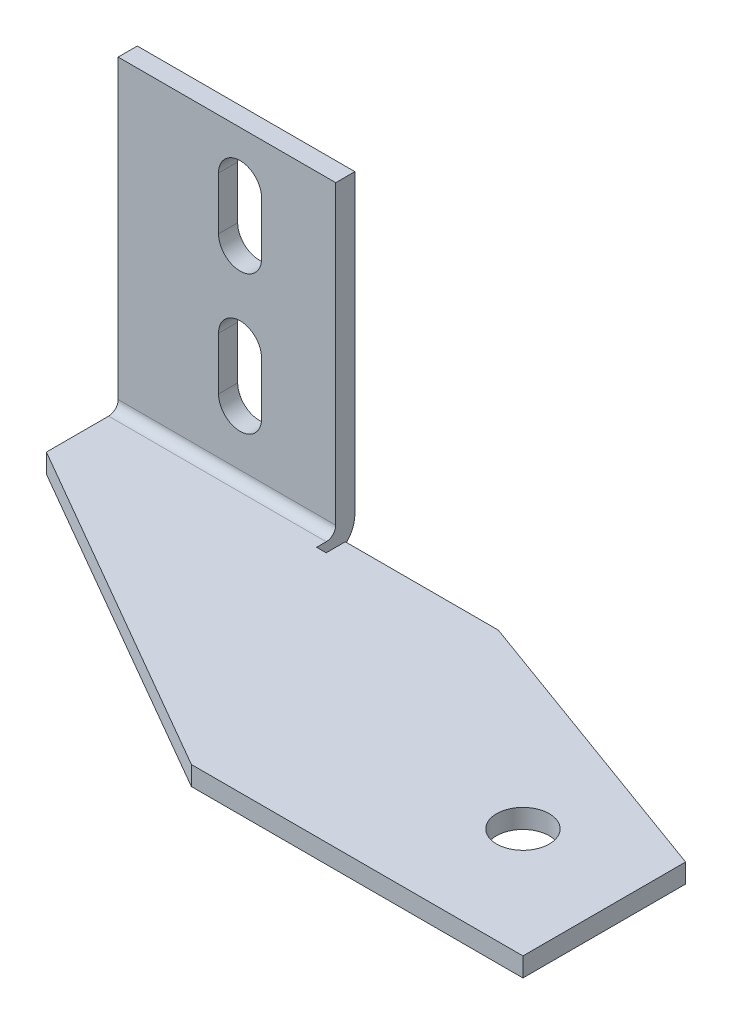
ISO-10303-21;
HEADER;
FILE_DESCRIPTION(('STEP AP214'),'2;1');
FILE_NAME('part.step','',(''),(''),'','','');
FILE_SCHEMA(('AUTOMOTIVE_DESIGN { 1 0 10303 214 1 1 1 1 }'));
ENDSEC;
DATA;
#1=APPLICATION_CONTEXT('core data for automotive mechanical design processes');
#2=APPLICATION_PROTOCOL_DEFINITION('international standard','automotive_design',2000,#1);
#3=PRODUCT_CONTEXT('',#1,'mechanical');
#4=PRODUCT('Part','Part','',(#3));
#5=PRODUCT_RELATED_PRODUCT_CATEGORY('part','',(#4));
#6=PRODUCT_DEFINITION_FORMATION('','',#4);
#7=PRODUCT_DEFINITION_CONTEXT('part definition',#1,'design');
#8=PRODUCT_DEFINITION('design','',#6,#7);
#9=PRODUCT_DEFINITION_SHAPE('','',#8);
#10=(LENGTH_UNIT() NAMED_UNIT(*) SI_UNIT(.MILLI.,.METRE.));
#11=(NAMED_UNIT(*) PLANE_ANGLE_UNIT() SI_UNIT($,.RADIAN.));
#12=(NAMED_UNIT(*) SI_UNIT($,.STERADIAN.) SOLID_ANGLE_UNIT());
#13=UNCERTAINTY_MEASURE_WITH_UNIT(LENGTH_MEASURE(1.E-05),#10,'distance_accuracy_value','');
#14=(GEOMETRIC_REPRESENTATION_CONTEXT(3) GLOBAL_UNCERTAINTY_ASSIGNED_CONTEXT((#13)) GLOBAL_UNIT_ASSIGNED_CONTEXT((#10,
#11,#12)) REPRESENTATION_CONTEXT('',''));
#15=CARTESIAN_POINT('',(0.,0.,0.));
#16=DIRECTION('',(0.,0.,1.));
#17=DIRECTION('',(1.,0.,0.));
#18=AXIS2_PLACEMENT_3D('',#15,#16,#17);
#19=CARTESIAN_POINT('',(0.,34.,0.));
#20=DIRECTION('',(0.,0.,1.));
#21=DIRECTION('',(1.,0.,0.));
#22=AXIS2_PLACEMENT_3D('',#19,#20,#21);
#23=PLANE('',#22);
#24=DIRECTION('',(0.,-1.,0.));
#25=VECTOR('',#24,1.);
#26=CARTESIAN_POINT('',(0.,34.,0.));
#27=LINE('',#26,#25);
#28=CARTESIAN_POINT('',(0.,34.,0.));
#29=VERTEX_POINT('',#28);
#30=CARTESIAN_POINT('',(0.,3.,0.));
#31=VERTEX_POINT('',#30);
#32=EDGE_CURVE('E340',#29,#31,#27,.T.);
#33=ORIENTED_EDGE('',*,*,#32,.T.);
#34=DIRECTION('',(-1.,0.,0.));
#35=VECTOR('',#34,1.);
#36=CARTESIAN_POINT('',(0.,3.,0.));
#37=LINE('',#36,#35);
#38=CARTESIAN_POINT('',(22.7379024351809,3.,0.));
#39=VERTEX_POINT('',#38);
#40=EDGE_CURVE('E64',#31,#39,#37,.F.);
#41=ORIENTED_EDGE('',*,*,#40,.T.);
#42=DIRECTION('',(0.,-1.,0.));
#43=VECTOR('',#42,1.);
#44=CARTESIAN_POINT('',(22.7379024351809,34.,0.));
#45=LINE('',#44,#43);
#46=CARTESIAN_POINT('',(22.7379024351809,34.,0.));
#47=VERTEX_POINT('',#46);
#48=EDGE_CURVE('E344',#47,#39,#45,.T.);
#49=ORIENTED_EDGE('',*,*,#48,.F.);
#50=DIRECTION('',(-1.,0.,0.));
#51=VECTOR('',#50,1.);
#52=CARTESIAN_POINT('',(0.,34.,0.));
#53=LINE('',#52,#51);
#54=EDGE_CURVE('E335',#47,#29,#53,.T.);
#55=ORIENTED_EDGE('',*,*,#54,.T.);
#56=EDGE_LOOP('',(#33,#41,#49,#55));
#57=FACE_BOUND('',#56,.T.);
#58=DIRECTION('',(0.,1.,0.));
#59=VECTOR('',#58,1.);
#60=CARTESIAN_POINT('',(10.4879024351809,14.25,0.));
#61=LINE('',#60,#59);
#62=CARTESIAN_POINT('',(10.4879024351809,8.74999999999999,0.));
#63=VERTEX_POINT('',#62);
#64=CARTESIAN_POINT('',(10.4879024351809,14.25,0.));
#65=VERTEX_POINT('',#64);
#66=EDGE_CURVE('E297',#63,#65,#61,.T.);
#67=ORIENTED_EDGE('',*,*,#66,.T.);
#68=CARTESIAN_POINT('',(12.7379024351809,14.25,0.));
#69=DIRECTION('',(0.,0.,-1.));
#70=DIRECTION('',(1.,0.,0.));
#71=AXIS2_PLACEMENT_3D('',#68,#69,#70);
#72=CIRCLE('',#71,2.25);
#73=CARTESIAN_POINT('',(14.9879024351809,14.25,0.));
#74=VERTEX_POINT('',#73);
#75=EDGE_CURVE('E260',#65,#74,#72,.T.);
#76=ORIENTED_EDGE('',*,*,#75,.T.);
#77=DIRECTION('',(0.,-1.,0.));
#78=VECTOR('',#77,1.);
#79=CARTESIAN_POINT('',(14.9879024351809,14.25,0.));
#80=LINE('',#79,#78);
#81=CARTESIAN_POINT('',(14.9879024351809,8.74999999999999,0.));
#82=VERTEX_POINT('',#81);
#83=EDGE_CURVE('E306',#74,#82,#80,.T.);
#84=ORIENTED_EDGE('',*,*,#83,.T.);
#85=CARTESIAN_POINT('',(12.7379024351809,8.74999999999999,0.));
#86=DIRECTION('',(0.,0.,-1.));
#87=DIRECTION('',(1.,0.,0.));
#88=AXIS2_PLACEMENT_3D('',#85,#86,#87);
#89=CIRCLE('',#88,2.25);
#90=EDGE_CURVE('E301',#82,#63,#89,.T.);
#91=ORIENTED_EDGE('',*,*,#90,.T.);
#92=EDGE_LOOP('',(#67,#76,#84,#91));
#93=FACE_BOUND('',#92,.T.);
#94=DIRECTION('',(0.,1.,0.));
#95=VECTOR('',#94,1.);
#96=CARTESIAN_POINT('',(10.4879024351809,28.75,0.));
#97=LINE('',#96,#95);
#98=CARTESIAN_POINT('',(10.4879024351809,23.25,0.));
#99=VERTEX_POINT('',#98);
#100=CARTESIAN_POINT('',(10.4879024351809,28.75,0.));
#101=VERTEX_POINT('',#100);
#102=EDGE_CURVE('E244',#99,#101,#97,.T.);
#103=ORIENTED_EDGE('',*,*,#102,.T.);
#104=CARTESIAN_POINT('',(12.7379024351809,28.75,0.));
#105=DIRECTION('',(0.,0.,-1.));
#106=DIRECTION('',(1.,0.,0.));
#107=AXIS2_PLACEMENT_3D('',#104,#105,#106);
#108=CIRCLE('',#107,2.25);
#109=CARTESIAN_POINT('',(14.9879024351809,28.75,0.));
#110=VERTEX_POINT('',#109);
#111=EDGE_CURVE('E255',#101,#110,#108,.T.);
#112=ORIENTED_EDGE('',*,*,#111,.T.);
#113=DIRECTION('',(0.,-1.,0.));
#114=VECTOR('',#113,1.);
#115=CARTESIAN_POINT('',(14.9879024351809,28.75,0.));
#116=LINE('',#115,#114);
#117=CARTESIAN_POINT('',(14.9879024351809,23.25,0.));
#118=VERTEX_POINT('',#117);
#119=EDGE_CURVE('E259',#110,#118,#116,.T.);
#120=ORIENTED_EDGE('',*,*,#119,.T.);
#121=CARTESIAN_POINT('',(12.7379024351809,23.25,0.));
#122=DIRECTION('',(0.,0.,-1.));
#123=DIRECTION('',(1.,0.,0.));
#124=AXIS2_PLACEMENT_3D('',#121,#122,#123);
#125=CIRCLE('',#124,2.25);
#126=EDGE_CURVE('E264',#118,#99,#125,.T.);
#127=ORIENTED_EDGE('',*,*,#126,.T.);
#128=EDGE_LOOP('',(#103,#112,#120,#127));
#129=FACE_BOUND('',#128,.T.);
#130=ADVANCED_FACE('F42',(#57,#93,#129),#23,.T.);
#131=CARTESIAN_POINT('',(22.7379024351809,34.,-2.));
#132=DIRECTION('',(0.,0.,-1.));
#133=DIRECTION('',(-1.,0.,0.));
#134=AXIS2_PLACEMENT_3D('',#131,#132,#133);
#135=PLANE('',#134);
#136=DIRECTION('',(0.,-1.,0.));
#137=VECTOR('',#136,1.);
#138=CARTESIAN_POINT('',(22.7379024351809,34.,-2.));
#139=LINE('',#138,#137);
#140=CARTESIAN_POINT('',(22.7379024351809,34.,-2.));
#141=VERTEX_POINT('',#140);
#142=CARTESIAN_POINT('',(22.7379024351809,3.,-2.));
#143=VERTEX_POINT('',#142);
#144=EDGE_CURVE('E347',#141,#143,#139,.T.);
#145=ORIENTED_EDGE('',*,*,#144,.T.);
#146=DIRECTION('',(1.,0.,0.));
#147=VECTOR('',#146,1.);
#148=CARTESIAN_POINT('',(22.7379024351809,3.,-2.));
#149=LINE('',#148,#147);
#150=CARTESIAN_POINT('',(0.,3.,-2.));
#151=VERTEX_POINT('',#150);
#152=EDGE_CURVE('E424',#143,#151,#149,.F.);
#153=ORIENTED_EDGE('',*,*,#152,.T.);
#154=DIRECTION('',(0.,-1.,0.));
#155=VECTOR('',#154,1.);
#156=CARTESIAN_POINT('',(0.,34.,-2.));
#157=LINE('',#156,#155);
#158=CARTESIAN_POINT('',(0.,34.,-2.));
#159=VERTEX_POINT('',#158);
#160=EDGE_CURVE('E338',#159,#151,#157,.T.);
#161=ORIENTED_EDGE('',*,*,#160,.F.);
#162=DIRECTION('',(1.,0.,0.));
#163=VECTOR('',#162,1.);
#164=CARTESIAN_POINT('',(22.7379024351809,34.,-2.));
#165=LINE('',#164,#163);
#166=EDGE_CURVE('E327',#159,#141,#165,.T.);
#167=ORIENTED_EDGE('',*,*,#166,.T.);
#168=EDGE_LOOP('',(#145,#153,#161,#167));
#169=FACE_BOUND('',#168,.T.);
#170=DIRECTION('',(0.,-1.,0.));
#171=VECTOR('',#170,1.);
#172=CARTESIAN_POINT('',(14.9879024351809,14.25,-2.));
#173=LINE('',#172,#171);
#174=CARTESIAN_POINT('',(14.9879024351809,14.25,-2.));
#175=VERTEX_POINT('',#174);
#176=CARTESIAN_POINT('',(14.9879024351809,8.74999999999999,-2.));
#177=VERTEX_POINT('',#176);
#178=EDGE_CURVE('E319',#175,#177,#173,.T.);
#179=ORIENTED_EDGE('',*,*,#178,.F.);
#180=CARTESIAN_POINT('',(12.7379024351809,14.25,-2.));
#181=DIRECTION('',(0.,0.,-1.));
#182=DIRECTION('',(1.,0.,0.));
#183=AXIS2_PLACEMENT_3D('',#180,#181,#182);
#184=CIRCLE('',#183,2.25);
#185=CARTESIAN_POINT('',(10.4879024351809,14.25,-2.));
#186=VERTEX_POINT('',#185);
#187=EDGE_CURVE('E302',#186,#175,#184,.T.);
#188=ORIENTED_EDGE('',*,*,#187,.F.);
#189=DIRECTION('',(0.,1.,0.));
#190=VECTOR('',#189,1.);
#191=CARTESIAN_POINT('',(10.4879024351809,14.25,-2.));
#192=LINE('',#191,#190);
#193=CARTESIAN_POINT('',(10.4879024351809,8.74999999999999,-2.));
#194=VERTEX_POINT('',#193);
#195=EDGE_CURVE('E296',#194,#186,#192,.T.);
#196=ORIENTED_EDGE('',*,*,#195,.F.);
#197=CARTESIAN_POINT('',(12.7379024351809,8.74999999999999,-2.));
#198=DIRECTION('',(0.,0.,-1.));
#199=DIRECTION('',(1.,0.,0.));
#200=AXIS2_PLACEMENT_3D('',#197,#198,#199);
#201=CIRCLE('',#200,2.25);
#202=EDGE_CURVE('E315',#177,#194,#201,.T.);
#203=ORIENTED_EDGE('',*,*,#202,.F.);
#204=EDGE_LOOP('',(#179,#188,#196,#203));
#205=FACE_BOUND('',#204,.T.);
#206=DIRECTION('',(0.,-1.,0.));
#207=VECTOR('',#206,1.);
#208=CARTESIAN_POINT('',(14.9879024351809,28.75,-2.));
#209=LINE('',#208,#207);
#210=CARTESIAN_POINT('',(14.9879024351809,28.75,-2.));
#211=VERTEX_POINT('',#210);
#212=CARTESIAN_POINT('',(14.9879024351809,23.25,-2.));
#213=VERTEX_POINT('',#212);
#214=EDGE_CURVE('E243',#211,#213,#209,.T.);
#215=ORIENTED_EDGE('',*,*,#214,.F.);
#216=CARTESIAN_POINT('',(12.7379024351809,28.75,-2.));
#217=DIRECTION('',(0.,0.,-1.));
#218=DIRECTION('',(1.,0.,0.));
#219=AXIS2_PLACEMENT_3D('',#216,#217,#218);
#220=CIRCLE('',#219,2.25);
#221=CARTESIAN_POINT('',(10.4879024351809,28.75,-2.));
#222=VERTEX_POINT('',#221);
#223=EDGE_CURVE('E240',#222,#211,#220,.T.);
#224=ORIENTED_EDGE('',*,*,#223,.F.);
#225=DIRECTION('',(0.,1.,0.));
#226=VECTOR('',#225,1.);
#227=CARTESIAN_POINT('',(10.4879024351809,28.75,-2.));
#228=LINE('',#227,#226);
#229=CARTESIAN_POINT('',(10.4879024351809,23.25,-2.));
#230=VERTEX_POINT('',#229);
#231=EDGE_CURVE('E251',#230,#222,#228,.T.);
#232=ORIENTED_EDGE('',*,*,#231,.F.);
#233=CARTESIAN_POINT('',(12.7379024351809,23.25,-2.));
#234=DIRECTION('',(0.,0.,-1.));
#235=DIRECTION('',(1.,0.,0.));
#236=AXIS2_PLACEMENT_3D('',#233,#234,#235);
#237=CIRCLE('',#236,2.25);
#238=EDGE_CURVE('E247',#213,#230,#237,.T.);
#239=ORIENTED_EDGE('',*,*,#238,.F.);
#240=EDGE_LOOP('',(#215,#224,#232,#239));
#241=FACE_BOUND('',#240,.T.);
#242=ADVANCED_FACE('F476',(#169,#205,#241),#135,.T.);
#243=CARTESIAN_POINT('',(0.,2.,0.));
#244=DIRECTION('',(0.,0.,1.));
#245=DIRECTION('',(1.,0.,0.));
#246=AXIS2_PLACEMENT_3D('',#243,#244,#245);
#247=PLANE('',#246);
#248=DIRECTION('',(-1.,0.,0.));
#249=VECTOR('',#248,1.);
#250=CARTESIAN_POINT('',(0.,0.,0.));
#251=LINE('',#250,#249);
#252=CARTESIAN_POINT('',(39.7282529021083,0.,0.));
#253=VERTEX_POINT('',#252);
#254=CARTESIAN_POINT('',(23.7379024351809,0.,0.));
#255=VERTEX_POINT('',#254);
#256=EDGE_CURVE('E366',#253,#255,#251,.T.);
#257=ORIENTED_EDGE('',*,*,#256,.T.);
#258=DIRECTION('',(0.,1.,0.));
#259=VECTOR('',#258,1.);
#260=CARTESIAN_POINT('',(23.7379024351809,0.,0.));
#261=LINE('',#260,#259);
#262=CARTESIAN_POINT('',(23.7379024351809,2.,0.));
#263=VERTEX_POINT('',#262);
#264=EDGE_CURVE('E233',#255,#263,#261,.T.);
#265=ORIENTED_EDGE('',*,*,#264,.T.);
#266=DIRECTION('',(-1.,0.,0.));
#267=VECTOR('',#266,1.);
#268=CARTESIAN_POINT('',(0.,2.,0.));
#269=LINE('',#268,#267);
#270=CARTESIAN_POINT('',(39.7282529021083,2.,0.));
#271=VERTEX_POINT('',#270);
#272=EDGE_CURVE('E378',#271,#263,#269,.T.);
#273=ORIENTED_EDGE('',*,*,#272,.F.);
#274=DIRECTION('',(0.,-1.,0.));
#275=VECTOR('',#274,1.);
#276=CARTESIAN_POINT('',(39.7282529021083,2.,0.));
#277=LINE('',#276,#275);
#278=EDGE_CURVE('E382',#271,#253,#277,.T.);
#279=ORIENTED_EDGE('',*,*,#278,.T.);
#280=EDGE_LOOP('',(#257,#265,#273,#279));
#281=FACE_BOUND('',#280,.T.);
#282=ADVANCED_FACE('F466',(#281),#247,.F.);
#283=CARTESIAN_POINT('',(0.,2.,7.5));
#284=DIRECTION('',(1.,0.,0.));
#285=DIRECTION('',(0.,0.,-1.));
#286=AXIS2_PLACEMENT_3D('',#283,#284,#285);
#287=PLANE('',#286);
#288=ORIENTED_EDGE('',*,*,#160,.T.);
#289=CARTESIAN_POINT('',(0.,3.,0.999999999999997));
#290=DIRECTION('',(1.,0.,0.));
#291=DIRECTION('',(0.,0.,-1.));
#292=AXIS2_PLACEMENT_3D('',#289,#290,#291);
#293=CIRCLE('',#292,3.);
#294=CARTESIAN_POINT('',(0.,0.,0.999999999999998));
#295=VERTEX_POINT('',#294);
#296=EDGE_CURVE('E427',#151,#295,#293,.F.);
#297=ORIENTED_EDGE('',*,*,#296,.T.);
#298=DIRECTION('',(0.,0.,1.));
#299=VECTOR('',#298,1.);
#300=CARTESIAN_POINT('',(0.,0.,7.5));
#301=LINE('',#300,#299);
#302=CARTESIAN_POINT('',(0.,0.,7.5));
#303=VERTEX_POINT('',#302);
#304=EDGE_CURVE('E358',#295,#303,#301,.T.);
#305=ORIENTED_EDGE('',*,*,#304,.T.);
#306=DIRECTION('',(0.,-1.,0.));
#307=VECTOR('',#306,1.);
#308=CARTESIAN_POINT('',(0.,2.,7.5));
#309=LINE('',#308,#307);
#310=CARTESIAN_POINT('',(0.,2.,7.5));
#311=VERTEX_POINT('',#310);
#312=EDGE_CURVE('E415',#311,#303,#309,.T.);
#313=ORIENTED_EDGE('',*,*,#312,.F.);
#314=DIRECTION('',(0.,0.,1.));
#315=VECTOR('',#314,1.);
#316=CARTESIAN_POINT('',(0.,2.,7.5));
#317=LINE('',#316,#315);
#318=CARTESIAN_POINT('',(0.,2.,1.));
#319=VERTEX_POINT('',#318);
#320=EDGE_CURVE('E362',#319,#311,#317,.T.);
#321=ORIENTED_EDGE('',*,*,#320,.F.);
#322=CARTESIAN_POINT('',(0.,3.,1.));
#323=DIRECTION('',(1.,0.,0.));
#324=DIRECTION('',(0.,0.,-1.));
#325=AXIS2_PLACEMENT_3D('',#322,#323,#324);
#326=CIRCLE('',#325,1.);
#327=EDGE_CURVE('E51',#319,#31,#326,.T.);
#328=ORIENTED_EDGE('',*,*,#327,.T.);
#329=ORIENTED_EDGE('',*,*,#32,.F.);
#330=DIRECTION('',(0.,0.,-1.));
#331=VECTOR('',#330,1.);
#332=CARTESIAN_POINT('',(0.,34.,-2.));
#333=LINE('',#332,#331);
#334=EDGE_CURVE('E203',#29,#159,#333,.T.);
#335=ORIENTED_EDGE('',*,*,#334,.T.);
#336=EDGE_LOOP('',(#288,#297,#305,#313,#321,#328,#329,#335));
#337=FACE_BOUND('',#336,.T.);
#338=ADVANCED_FACE('F443',(#337),#287,.F.);
#339=CARTESIAN_POINT('',(35.853451716676,2.,28.2));
#340=DIRECTION('',(0.499999999999998,0.,-0.86602540378444));
#341=DIRECTION('',(-0.86602540378444,0.,-0.499999999999998));
#342=AXIS2_PLACEMENT_3D('',#339,#340,#341);
#343=PLANE('',#342);
#344=DIRECTION('',(0.86602540378444,0.,0.499999999999998));
#345=VECTOR('',#344,1.);
#346=CARTESIAN_POINT('',(35.853451716676,0.,28.2));
#347=LINE('',#346,#345);
#348=CARTESIAN_POINT('',(35.853451716676,0.,28.2));
#349=VERTEX_POINT('',#348);
#350=EDGE_CURVE('E385',#303,#349,#347,.T.);
#351=ORIENTED_EDGE('',*,*,#350,.T.);
#352=DIRECTION('',(0.,-1.,0.));
#353=VECTOR('',#352,1.);
#354=CARTESIAN_POINT('',(35.853451716676,2.,28.2));
#355=LINE('',#354,#353);
#356=CARTESIAN_POINT('',(35.853451716676,2.,28.2));
#357=VERTEX_POINT('',#356);
#358=EDGE_CURVE('E411',#357,#349,#355,.T.);
#359=ORIENTED_EDGE('',*,*,#358,.F.);
#360=DIRECTION('',(0.86602540378444,0.,0.499999999999998));
#361=VECTOR('',#360,1.);
#362=CARTESIAN_POINT('',(35.853451716676,2.,28.2));
#363=LINE('',#362,#361);
#364=EDGE_CURVE('E365',#311,#357,#363,.T.);
#365=ORIENTED_EDGE('',*,*,#364,.F.);
#366=ORIENTED_EDGE('',*,*,#312,.T.);
#367=EDGE_LOOP('',(#351,#359,#365,#366));
#368=FACE_BOUND('',#367,.T.);
#369=ADVANCED_FACE('F446',(#368),#343,.F.);
#370=CARTESIAN_POINT('',(70.5,2.,28.2));
#371=DIRECTION('',(0.,0.,-1.));
#372=DIRECTION('',(-1.,0.,0.));
#373=AXIS2_PLACEMENT_3D('',#370,#371,#372);
#374=PLANE('',#373);
#375=DIRECTION('',(1.,0.,0.));
#376=VECTOR('',#375,1.);
#377=CARTESIAN_POINT('',(70.5,0.,28.2));
#378=LINE('',#377,#376);
#379=CARTESIAN_POINT('',(70.5,0.,28.2));
#380=VERTEX_POINT('',#379);
#381=EDGE_CURVE('E388',#349,#380,#378,.T.);
#382=ORIENTED_EDGE('',*,*,#381,.T.);
#383=DIRECTION('',(0.,-1.,0.));
#384=VECTOR('',#383,1.);
#385=CARTESIAN_POINT('',(70.5,2.,28.2));
#386=LINE('',#385,#384);
#387=CARTESIAN_POINT('',(70.5,2.,28.2));
#388=VERTEX_POINT('',#387);
#389=EDGE_CURVE('E407',#388,#380,#386,.T.);
#390=ORIENTED_EDGE('',*,*,#389,.F.);
#391=DIRECTION('',(1.,0.,0.));
#392=VECTOR('',#391,1.);
#393=CARTESIAN_POINT('',(70.5,2.,28.2));
#394=LINE('',#393,#392);
#395=EDGE_CURVE('E369',#357,#388,#394,.T.);
#396=ORIENTED_EDGE('',*,*,#395,.F.);
#397=ORIENTED_EDGE('',*,*,#358,.T.);
#398=EDGE_LOOP('',(#382,#390,#396,#397));
#399=FACE_BOUND('',#398,.T.);
#400=ADVANCED_FACE('F453',(#399),#374,.F.);
#401=CARTESIAN_POINT('',(70.5,2.,11.2));
#402=DIRECTION('',(-1.,0.,0.));
#403=DIRECTION('',(0.,0.,1.));
#404=AXIS2_PLACEMENT_3D('',#401,#402,#403);
#405=PLANE('',#404);
#406=DIRECTION('',(0.,0.,-1.));
#407=VECTOR('',#406,1.);
#408=CARTESIAN_POINT('',(70.5,0.,11.2));
#409=LINE('',#408,#407);
#410=CARTESIAN_POINT('',(70.5,0.,11.2));
#411=VERTEX_POINT('',#410);
#412=EDGE_CURVE('E391',#380,#411,#409,.T.);
#413=ORIENTED_EDGE('',*,*,#412,.T.);
#414=DIRECTION('',(0.,-1.,0.));
#415=VECTOR('',#414,1.);
#416=CARTESIAN_POINT('',(70.5,2.,11.2));
#417=LINE('',#416,#415);
#418=CARTESIAN_POINT('',(70.5,2.,11.2));
#419=VERTEX_POINT('',#418);
#420=EDGE_CURVE('E403',#419,#411,#417,.T.);
#421=ORIENTED_EDGE('',*,*,#420,.F.);
#422=DIRECTION('',(0.,0.,-1.));
#423=VECTOR('',#422,1.);
#424=CARTESIAN_POINT('',(70.5,2.,11.2));
#425=LINE('',#424,#423);
#426=EDGE_CURVE('E372',#388,#419,#425,.T.);
#427=ORIENTED_EDGE('',*,*,#426,.F.);
#428=ORIENTED_EDGE('',*,*,#389,.T.);
#429=EDGE_LOOP('',(#413,#421,#427,#428));
#430=FACE_BOUND('',#429,.T.);
#431=ADVANCED_FACE('F457',(#430),#405,.F.);
#432=CARTESIAN_POINT('',(39.7282529021083,2.,0.));
#433=DIRECTION('',(-0.34202014332567,0.,0.939692620785908));
#434=DIRECTION('',(0.939692620785908,0.,0.34202014332567));
#435=AXIS2_PLACEMENT_3D('',#432,#433,#434);
#436=PLANE('',#435);
#437=DIRECTION('',(-0.939692620785908,0.,-0.34202014332567));
#438=VECTOR('',#437,1.);
#439=CARTESIAN_POINT('',(39.7282529021083,0.,0.));
#440=LINE('',#439,#438);
#441=EDGE_CURVE('E394',#411,#253,#440,.T.);
#442=ORIENTED_EDGE('',*,*,#441,.T.);
#443=ORIENTED_EDGE('',*,*,#278,.F.);
#444=DIRECTION('',(-0.939692620785908,0.,-0.34202014332567));
#445=VECTOR('',#444,1.);
#446=CARTESIAN_POINT('',(39.7282529021083,2.,0.));
#447=LINE('',#446,#445);
#448=EDGE_CURVE('E375',#419,#271,#447,.T.);
#449=ORIENTED_EDGE('',*,*,#448,.F.);
#450=ORIENTED_EDGE('',*,*,#420,.T.);
#451=EDGE_LOOP('',(#442,#443,#449,#450));
#452=FACE_BOUND('',#451,.T.);
#453=ADVANCED_FACE('F462',(#452),#436,.F.);
#454=CARTESIAN_POINT('',(0.,2.,0.));
#455=DIRECTION('',(0.,-1.,0.));
#456=DIRECTION('',(0.,0.,-1.));
#457=AXIS2_PLACEMENT_3D('',#454,#455,#456);
#458=PLANE('',#457);
#459=CARTESIAN_POINT('',(59.,2.,16.7));
#460=DIRECTION('',(0.,1.,0.));
#461=DIRECTION('',(0.,0.,1.));
#462=AXIS2_PLACEMENT_3D('',#459,#460,#461);
#463=CIRCLE('',#462,2.75);
#464=CARTESIAN_POINT('',(59.,2.,19.45));
#465=VERTEX_POINT('',#464);
#466=EDGE_CURVE('E343',#465,#465,#463,.T.);
#467=ORIENTED_EDGE('',*,*,#466,.F.);
#468=EDGE_LOOP('',(#467));
#469=FACE_BOUND('',#468,.T.);
#470=DIRECTION('',(0.,0.,1.));
#471=VECTOR('',#470,1.);
#472=CARTESIAN_POINT('',(22.7379024351809,2.,0.));
#473=LINE('',#472,#471);
#474=CARTESIAN_POINT('',(22.7379024351809,2.,1.));
#475=VERTEX_POINT('',#474);
#476=CARTESIAN_POINT('',(22.7379024351809,2.,2.));
#477=VERTEX_POINT('',#476);
#478=EDGE_CURVE('E210',#475,#477,#473,.T.);
#479=ORIENTED_EDGE('',*,*,#478,.F.);
#480=DIRECTION('',(-1.,0.,0.));
#481=VECTOR('',#480,1.);
#482=CARTESIAN_POINT('',(0.,2.,1.));
#483=LINE('',#482,#481);
#484=EDGE_CURVE('E430',#475,#319,#483,.T.);
#485=ORIENTED_EDGE('',*,*,#484,.T.);
#486=ORIENTED_EDGE('',*,*,#320,.T.);
#487=ORIENTED_EDGE('',*,*,#364,.T.);
#488=ORIENTED_EDGE('',*,*,#395,.T.);
#489=ORIENTED_EDGE('',*,*,#426,.T.);
#490=ORIENTED_EDGE('',*,*,#448,.T.);
#491=ORIENTED_EDGE('',*,*,#272,.T.);
#492=DIRECTION('',(0.,0.,-1.));
#493=VECTOR('',#492,1.);
#494=CARTESIAN_POINT('',(23.7379024351809,2.,2.));
#495=LINE('',#494,#493);
#496=CARTESIAN_POINT('',(23.7379024351809,2.,2.));
#497=VERTEX_POINT('',#496);
#498=EDGE_CURVE('E221',#497,#263,#495,.T.);
#499=ORIENTED_EDGE('',*,*,#498,.F.);
#500=DIRECTION('',(1.,0.,0.));
#501=VECTOR('',#500,1.);
#502=CARTESIAN_POINT('',(22.7379024351809,2.,2.));
#503=LINE('',#502,#501);
#504=EDGE_CURVE('E226',#477,#497,#503,.T.);
#505=ORIENTED_EDGE('',*,*,#504,.F.);
#506=EDGE_LOOP('',(#479,#485,#486,#487,#488,#489,#490,#491,#499,#505));
#507=FACE_BOUND('',#506,.T.);
#508=ADVANCED_FACE('F438',(#469,#507),#458,.F.);
#509=CARTESIAN_POINT('',(0.,0.,0.));
#510=DIRECTION('',(0.,-1.,0.));
#511=DIRECTION('',(0.,0.,-1.));
#512=AXIS2_PLACEMENT_3D('',#509,#510,#511);
#513=PLANE('',#512);
#514=ORIENTED_EDGE('',*,*,#304,.F.);
#515=DIRECTION('',(1.,0.,0.));
#516=VECTOR('',#515,1.);
#517=CARTESIAN_POINT('',(0.,0.,0.999999999999997));
#518=LINE('',#517,#516);
#519=CARTESIAN_POINT('',(22.7379024351809,0.,1.));
#520=VERTEX_POINT('',#519);
#521=EDGE_CURVE('E200',#295,#520,#518,.T.);
#522=ORIENTED_EDGE('',*,*,#521,.T.);
#523=DIRECTION('',(0.,0.,1.));
#524=VECTOR('',#523,1.);
#525=CARTESIAN_POINT('',(22.7379024351809,0.,0.));
#526=LINE('',#525,#524);
#527=CARTESIAN_POINT('',(22.7379024351809,0.,2.));
#528=VERTEX_POINT('',#527);
#529=EDGE_CURVE('E191',#520,#528,#526,.T.);
#530=ORIENTED_EDGE('',*,*,#529,.T.);
#531=DIRECTION('',(1.,0.,0.));
#532=VECTOR('',#531,1.);
#533=CARTESIAN_POINT('',(22.7379024351809,0.,2.));
#534=LINE('',#533,#532);
#535=CARTESIAN_POINT('',(23.7379024351809,0.,2.));
#536=VERTEX_POINT('',#535);
#537=EDGE_CURVE('E198',#528,#536,#534,.T.);
#538=ORIENTED_EDGE('',*,*,#537,.T.);
#539=DIRECTION('',(0.,0.,-1.));
#540=VECTOR('',#539,1.);
#541=CARTESIAN_POINT('',(23.7379024351809,0.,2.));
#542=LINE('',#541,#540);
#543=EDGE_CURVE('E216',#536,#255,#542,.T.);
#544=ORIENTED_EDGE('',*,*,#543,.T.);
#545=ORIENTED_EDGE('',*,*,#256,.F.);
#546=ORIENTED_EDGE('',*,*,#441,.F.);
#547=ORIENTED_EDGE('',*,*,#412,.F.);
#548=ORIENTED_EDGE('',*,*,#381,.F.);
#549=ORIENTED_EDGE('',*,*,#350,.F.);
#550=EDGE_LOOP('',(#514,#522,#530,#538,#544,#545,#546,#547,#548,#549));
#551=FACE_BOUND('',#550,.T.);
#552=CARTESIAN_POINT('',(59.,0.,16.7));
#553=DIRECTION('',(0.,1.,0.));
#554=DIRECTION('',(0.,0.,1.));
#555=AXIS2_PLACEMENT_3D('',#552,#553,#554);
#556=CIRCLE('',#555,2.75);
#557=CARTESIAN_POINT('',(59.,0.,19.45));
#558=VERTEX_POINT('',#557);
#559=EDGE_CURVE('E354',#558,#558,#556,.T.);
#560=ORIENTED_EDGE('',*,*,#559,.T.);
#561=EDGE_LOOP('',(#560));
#562=FACE_BOUND('',#561,.T.);
#563=ADVANCED_FACE('F194',(#551,#562),#513,.T.);
#564=CARTESIAN_POINT('',(59.,0.,16.7));
#565=DIRECTION('',(0.,1.,0.));
#566=DIRECTION('',(0.,0.,1.));
#567=AXIS2_PLACEMENT_3D('',#564,#565,#566);
#568=CYLINDRICAL_SURFACE('',#567,2.75);
#569=ORIENTED_EDGE('',*,*,#559,.F.);
#570=EDGE_LOOP('',(#569));
#571=FACE_BOUND('',#570,.T.);
#572=ORIENTED_EDGE('',*,*,#466,.T.);
#573=EDGE_LOOP('',(#572));
#574=FACE_BOUND('',#573,.T.);
#575=ADVANCED_FACE('F498',(#571,#574),#568,.F.);
#576=CARTESIAN_POINT('',(22.7379024351809,34.,0.));
#577=DIRECTION('',(1.,0.,0.));
#578=DIRECTION('',(0.,0.,-1.));
#579=AXIS2_PLACEMENT_3D('',#576,#577,#578);
#580=PLANE('',#579);
#581=ORIENTED_EDGE('',*,*,#529,.F.);
#582=CARTESIAN_POINT('',(22.7379024351809,3.,1.));
#583=DIRECTION('',(1.,0.,0.));
#584=DIRECTION('',(0.,0.,-1.));
#585=AXIS2_PLACEMENT_3D('',#582,#583,#584);
#586=CIRCLE('',#585,3.);
#587=EDGE_CURVE('E421',#520,#143,#586,.T.);
#588=ORIENTED_EDGE('',*,*,#587,.T.);
#589=ORIENTED_EDGE('',*,*,#144,.F.);
#590=DIRECTION('',(0.,0.,1.));
#591=VECTOR('',#590,1.);
#592=CARTESIAN_POINT('',(22.7379024351809,34.,0.));
#593=LINE('',#592,#591);
#594=EDGE_CURVE('E331',#141,#47,#593,.T.);
#595=ORIENTED_EDGE('',*,*,#594,.T.);
#596=ORIENTED_EDGE('',*,*,#48,.T.);
#597=CARTESIAN_POINT('',(22.7379024351809,3.,1.));
#598=DIRECTION('',(1.,0.,0.));
#599=DIRECTION('',(0.,0.,-1.));
#600=AXIS2_PLACEMENT_3D('',#597,#598,#599);
#601=CIRCLE('',#600,1.);
#602=EDGE_CURVE('E11',#39,#475,#601,.F.);
#603=ORIENTED_EDGE('',*,*,#602,.T.);
#604=ORIENTED_EDGE('',*,*,#478,.T.);
#605=DIRECTION('',(0.,1.,0.));
#606=VECTOR('',#605,1.);
#607=CARTESIAN_POINT('',(22.7379024351809,0.,2.));
#608=LINE('',#607,#606);
#609=EDGE_CURVE('E207',#528,#477,#608,.T.);
#610=ORIENTED_EDGE('',*,*,#609,.F.);
#611=EDGE_LOOP('',(#581,#588,#589,#595,#596,#603,#604,#610));
#612=FACE_BOUND('',#611,.T.);
#613=ADVANCED_FACE('F208',(#612),#580,.T.);
#614=CARTESIAN_POINT('',(0.,34.,0.));
#615=DIRECTION('',(0.,1.,0.));
#616=DIRECTION('',(0.,0.,1.));
#617=AXIS2_PLACEMENT_3D('',#614,#615,#616);
#618=PLANE('',#617);
#619=ORIENTED_EDGE('',*,*,#334,.F.);
#620=ORIENTED_EDGE('',*,*,#54,.F.);
#621=ORIENTED_EDGE('',*,*,#594,.F.);
#622=ORIENTED_EDGE('',*,*,#166,.F.);
#623=EDGE_LOOP('',(#619,#620,#621,#622));
#624=FACE_BOUND('',#623,.T.);
#625=ADVANCED_FACE('F481',(#624),#618,.T.);
#626=CARTESIAN_POINT('',(12.7379024351809,14.25,-2.));
#627=DIRECTION('',(0.,0.,1.));
#628=DIRECTION('',(1.,0.,0.));
#629=AXIS2_PLACEMENT_3D('',#626,#627,#628);
#630=CYLINDRICAL_SURFACE('',#629,2.25);
#631=ORIENTED_EDGE('',*,*,#75,.F.);
#632=DIRECTION('',(0.,0.,1.));
#633=VECTOR('',#632,1.);
#634=CARTESIAN_POINT('',(10.4879024351809,14.25,-2.));
#635=LINE('',#634,#633);
#636=EDGE_CURVE('E292',#186,#65,#635,.T.);
#637=ORIENTED_EDGE('',*,*,#636,.F.);
#638=ORIENTED_EDGE('',*,*,#187,.T.);
#639=DIRECTION('',(0.,0.,1.));
#640=VECTOR('',#639,1.);
#641=CARTESIAN_POINT('',(14.9879024351809,14.25,-2.));
#642=LINE('',#641,#640);
#643=EDGE_CURVE('E237',#175,#74,#642,.T.);
#644=ORIENTED_EDGE('',*,*,#643,.T.);
#645=EDGE_LOOP('',(#631,#637,#638,#644));
#646=FACE_BOUND('',#645,.T.);
#647=ADVANCED_FACE('F563',(#646),#630,.F.);
#648=CARTESIAN_POINT('',(14.9879024351809,14.25,-2.));
#649=DIRECTION('',(-1.,0.,0.));
#650=DIRECTION('',(0.,-1.,0.));
#651=AXIS2_PLACEMENT_3D('',#648,#649,#650);
#652=PLANE('',#651);
#653=ORIENTED_EDGE('',*,*,#83,.F.);
#654=ORIENTED_EDGE('',*,*,#643,.F.);
#655=ORIENTED_EDGE('',*,*,#178,.T.);
#656=DIRECTION('',(0.,0.,1.));
#657=VECTOR('',#656,1.);
#658=CARTESIAN_POINT('',(14.9879024351809,8.74999999999999,-2.));
#659=LINE('',#658,#657);
#660=EDGE_CURVE('E286',#177,#82,#659,.T.);
#661=ORIENTED_EDGE('',*,*,#660,.T.);
#662=EDGE_LOOP('',(#653,#654,#655,#661));
#663=FACE_BOUND('',#662,.T.);
#664=ADVANCED_FACE('F569',(#663),#652,.T.);
#665=CARTESIAN_POINT('',(12.7379024351809,8.74999999999999,-2.));
#666=DIRECTION('',(0.,0.,1.));
#667=DIRECTION('',(1.,0.,0.));
#668=AXIS2_PLACEMENT_3D('',#665,#666,#667);
#669=CYLINDRICAL_SURFACE('',#668,2.25);
#670=ORIENTED_EDGE('',*,*,#90,.F.);
#671=ORIENTED_EDGE('',*,*,#660,.F.);
#672=ORIENTED_EDGE('',*,*,#202,.T.);
#673=DIRECTION('',(0.,0.,1.));
#674=VECTOR('',#673,1.);
#675=CARTESIAN_POINT('',(10.4879024351809,8.74999999999999,-2.));
#676=LINE('',#675,#674);
#677=EDGE_CURVE('E289',#194,#63,#676,.T.);
#678=ORIENTED_EDGE('',*,*,#677,.T.);
#679=EDGE_LOOP('',(#670,#671,#672,#678));
#680=FACE_BOUND('',#679,.T.);
#681=ADVANCED_FACE('F577',(#680),#669,.F.);
#682=CARTESIAN_POINT('',(10.4879024351809,14.25,-2.));
#683=DIRECTION('',(1.,0.,0.));
#684=DIRECTION('',(0.,1.,0.));
#685=AXIS2_PLACEMENT_3D('',#682,#683,#684);
#686=PLANE('',#685);
#687=ORIENTED_EDGE('',*,*,#66,.F.);
#688=ORIENTED_EDGE('',*,*,#677,.F.);
#689=ORIENTED_EDGE('',*,*,#195,.T.);
#690=ORIENTED_EDGE('',*,*,#636,.T.);
#691=EDGE_LOOP('',(#687,#688,#689,#690));
#692=FACE_BOUND('',#691,.T.);
#693=ADVANCED_FACE('F585',(#692),#686,.T.);
#694=CARTESIAN_POINT('',(12.7379024351809,28.75,-2.));
#695=DIRECTION('',(0.,0.,1.));
#696=DIRECTION('',(1.,0.,0.));
#697=AXIS2_PLACEMENT_3D('',#694,#695,#696);
#698=CYLINDRICAL_SURFACE('',#697,2.25);
#699=ORIENTED_EDGE('',*,*,#111,.F.);
#700=DIRECTION('',(0.,0.,1.));
#701=VECTOR('',#700,1.);
#702=CARTESIAN_POINT('',(10.4879024351809,28.75,-2.));
#703=LINE('',#702,#701);
#704=EDGE_CURVE('E254',#222,#101,#703,.T.);
#705=ORIENTED_EDGE('',*,*,#704,.F.);
#706=ORIENTED_EDGE('',*,*,#223,.T.);
#707=DIRECTION('',(0.,0.,1.));
#708=VECTOR('',#707,1.);
#709=CARTESIAN_POINT('',(14.9879024351809,28.75,-2.));
#710=LINE('',#709,#708);
#711=EDGE_CURVE('E204',#211,#110,#710,.T.);
#712=ORIENTED_EDGE('',*,*,#711,.T.);
#713=EDGE_LOOP('',(#699,#705,#706,#712));
#714=FACE_BOUND('',#713,.T.);
#715=ADVANCED_FACE('F593',(#714),#698,.F.);
#716=CARTESIAN_POINT('',(14.9879024351809,28.75,-2.));
#717=DIRECTION('',(-1.,0.,0.));
#718=DIRECTION('',(0.,0.,1.));
#719=AXIS2_PLACEMENT_3D('',#716,#717,#718);
#720=PLANE('',#719);
#721=ORIENTED_EDGE('',*,*,#119,.F.);
#722=ORIENTED_EDGE('',*,*,#711,.F.);
#723=ORIENTED_EDGE('',*,*,#214,.T.);
#724=DIRECTION('',(0.,0.,1.));
#725=VECTOR('',#724,1.);
#726=CARTESIAN_POINT('',(14.9879024351809,23.25,-2.));
#727=LINE('',#726,#725);
#728=EDGE_CURVE('E277',#213,#118,#727,.T.);
#729=ORIENTED_EDGE('',*,*,#728,.T.);
#730=EDGE_LOOP('',(#721,#722,#723,#729));
#731=FACE_BOUND('',#730,.T.);
#732=ADVANCED_FACE('F600',(#731),#720,.T.);
#733=CARTESIAN_POINT('',(12.7379024351809,23.25,-2.));
#734=DIRECTION('',(0.,0.,1.));
#735=DIRECTION('',(1.,0.,0.));
#736=AXIS2_PLACEMENT_3D('',#733,#734,#735);
#737=CYLINDRICAL_SURFACE('',#736,2.25);
#738=ORIENTED_EDGE('',*,*,#126,.F.);
#739=ORIENTED_EDGE('',*,*,#728,.F.);
#740=ORIENTED_EDGE('',*,*,#238,.T.);
#741=DIRECTION('',(0.,0.,1.));
#742=VECTOR('',#741,1.);
#743=CARTESIAN_POINT('',(10.4879024351809,23.25,-2.));
#744=LINE('',#743,#742);
#745=EDGE_CURVE('E274',#230,#99,#744,.T.);
#746=ORIENTED_EDGE('',*,*,#745,.T.);
#747=EDGE_LOOP('',(#738,#739,#740,#746));
#748=FACE_BOUND('',#747,.T.);
#749=ADVANCED_FACE('F608',(#748),#737,.F.);
#750=CARTESIAN_POINT('',(10.4879024351809,28.75,-2.));
#751=DIRECTION('',(1.,0.,0.));
#752=DIRECTION('',(0.,1.,0.));
#753=AXIS2_PLACEMENT_3D('',#750,#751,#752);
#754=PLANE('',#753);
#755=ORIENTED_EDGE('',*,*,#102,.F.);
#756=ORIENTED_EDGE('',*,*,#745,.F.);
#757=ORIENTED_EDGE('',*,*,#231,.T.);
#758=ORIENTED_EDGE('',*,*,#704,.T.);
#759=EDGE_LOOP('',(#755,#756,#757,#758));
#760=FACE_BOUND('',#759,.T.);
#761=ADVANCED_FACE('F616',(#760),#754,.T.);
#762=CARTESIAN_POINT('',(23.7379024351809,0.,2.));
#763=DIRECTION('',(1.,0.,0.));
#764=DIRECTION('',(0.,0.,-1.));
#765=AXIS2_PLACEMENT_3D('',#762,#763,#764);
#766=PLANE('',#765);
#767=ORIENTED_EDGE('',*,*,#498,.T.);
#768=ORIENTED_EDGE('',*,*,#264,.F.);
#769=ORIENTED_EDGE('',*,*,#543,.F.);
#770=DIRECTION('',(0.,1.,0.));
#771=VECTOR('',#770,1.);
#772=CARTESIAN_POINT('',(23.7379024351809,0.,2.));
#773=LINE('',#772,#771);
#774=EDGE_CURVE('E215',#536,#497,#773,.T.);
#775=ORIENTED_EDGE('',*,*,#774,.T.);
#776=EDGE_LOOP('',(#767,#768,#769,#775));
#777=FACE_BOUND('',#776,.T.);
#778=ADVANCED_FACE('F469',(#777),#766,.F.);
#779=CARTESIAN_POINT('',(22.7379024351809,0.,2.));
#780=DIRECTION('',(0.,0.,1.));
#781=DIRECTION('',(1.,0.,0.));
#782=AXIS2_PLACEMENT_3D('',#779,#780,#781);
#783=PLANE('',#782);
#784=ORIENTED_EDGE('',*,*,#504,.T.);
#785=ORIENTED_EDGE('',*,*,#774,.F.);
#786=ORIENTED_EDGE('',*,*,#537,.F.);
#787=ORIENTED_EDGE('',*,*,#609,.T.);
#788=EDGE_LOOP('',(#784,#785,#786,#787));
#789=FACE_BOUND('',#788,.T.);
#790=ADVANCED_FACE('F218',(#789),#783,.F.);
#791=CARTESIAN_POINT('',(0.,3.,0.999999999999997));
#792=DIRECTION('',(1.,0.,0.));
#793=DIRECTION('',(0.,0.,-1.));
#794=AXIS2_PLACEMENT_3D('',#791,#792,#793);
#795=CYLINDRICAL_SURFACE('',#794,3.);
#796=ORIENTED_EDGE('',*,*,#296,.F.);
#797=ORIENTED_EDGE('',*,*,#152,.F.);
#798=ORIENTED_EDGE('',*,*,#587,.F.);
#799=ORIENTED_EDGE('',*,*,#521,.F.);
#800=EDGE_LOOP('',(#796,#797,#798,#799));
#801=FACE_BOUND('',#800,.T.);
#802=ADVANCED_FACE('F472',(#801),#795,.T.);
#803=CARTESIAN_POINT('',(0.,3.,1.));
#804=DIRECTION('',(-1.,0.,0.));
#805=DIRECTION('',(0.,0.,1.));
#806=AXIS2_PLACEMENT_3D('',#803,#804,#805);
#807=CYLINDRICAL_SURFACE('',#806,1.);
#808=ORIENTED_EDGE('',*,*,#602,.F.);
#809=ORIENTED_EDGE('',*,*,#40,.F.);
#810=ORIENTED_EDGE('',*,*,#327,.F.);
#811=ORIENTED_EDGE('',*,*,#484,.F.);
#812=EDGE_LOOP('',(#808,#809,#810,#811));
#813=FACE_BOUND('',#812,.T.);
#814=ADVANCED_FACE('F44',(#813),#807,.F.);
#815=CLOSED_SHELL('',(#130,#242,#282,#338,#369,#400,#431,#453,#508,#563,#575,#613,#625,#647,
#664,#681,#693,#715,#732,#749,#761,#778,#790,#802,#814));
#816=MANIFOLD_SOLID_BREP('B2',#815);
#817=ADVANCED_BREP_SHAPE_REPRESENTATION('',(#18,#816),#14);
#818=SHAPE_DEFINITION_REPRESENTATION(#9,#817);
ENDSEC;
END-ISO-10303-21;
